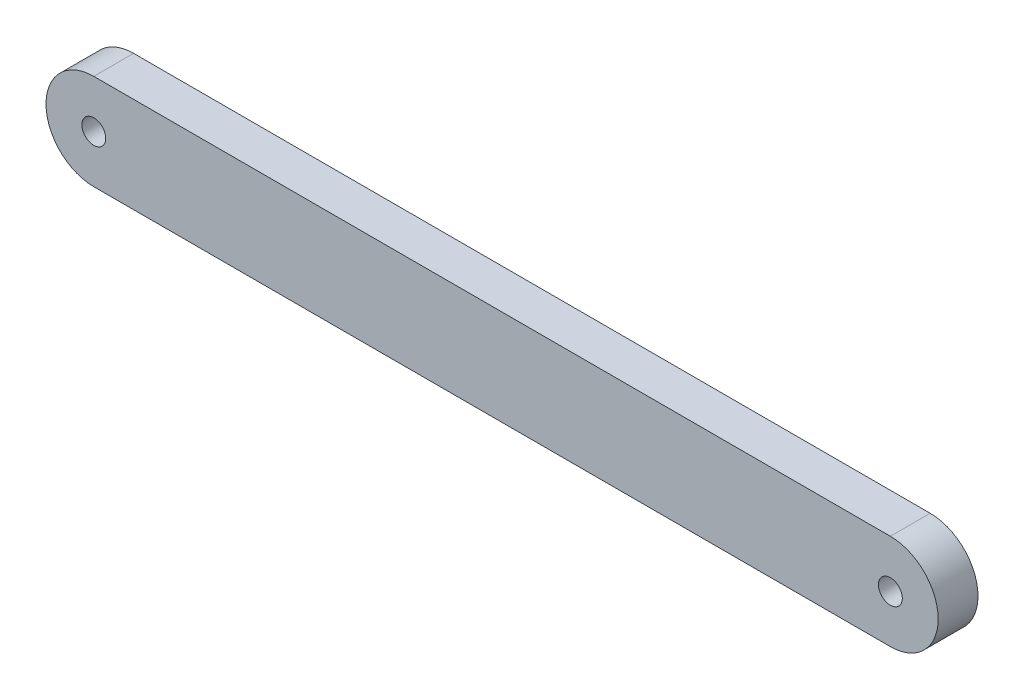
ISO-10303-21;
HEADER;
FILE_DESCRIPTION(('STEP AP214'),'2;1');
FILE_NAME('part.step','',(''),(''),'','','');
FILE_SCHEMA(('AUTOMOTIVE_DESIGN { 1 0 10303 214 1 1 1 1 }'));
ENDSEC;
DATA;
#1=APPLICATION_CONTEXT('core data for automotive mechanical design processes');
#2=APPLICATION_PROTOCOL_DEFINITION('international standard','automotive_design',2000,#1);
#3=PRODUCT_CONTEXT('',#1,'mechanical');
#4=PRODUCT('Part','Part','',(#3));
#5=PRODUCT_RELATED_PRODUCT_CATEGORY('part','',(#4));
#6=PRODUCT_DEFINITION_FORMATION('','',#4);
#7=PRODUCT_DEFINITION_CONTEXT('part definition',#1,'design');
#8=PRODUCT_DEFINITION('design','',#6,#7);
#9=PRODUCT_DEFINITION_SHAPE('','',#8);
#10=(LENGTH_UNIT() NAMED_UNIT(*) SI_UNIT(.MILLI.,.METRE.));
#11=(NAMED_UNIT(*) PLANE_ANGLE_UNIT() SI_UNIT($,.RADIAN.));
#12=(NAMED_UNIT(*) SI_UNIT($,.STERADIAN.) SOLID_ANGLE_UNIT());
#13=UNCERTAINTY_MEASURE_WITH_UNIT(LENGTH_MEASURE(1.E-05),#10,'distance_accuracy_value','');
#14=(GEOMETRIC_REPRESENTATION_CONTEXT(3) GLOBAL_UNCERTAINTY_ASSIGNED_CONTEXT((#13)) GLOBAL_UNIT_ASSIGNED_CONTEXT((#10,
#11,#12)) REPRESENTATION_CONTEXT('',''));
#15=CARTESIAN_POINT('',(0.,0.,0.));
#16=DIRECTION('',(0.,0.,1.));
#17=DIRECTION('',(1.,0.,0.));
#18=AXIS2_PLACEMENT_3D('',#15,#16,#17);
#19=CARTESIAN_POINT('',(-50.,0.,5.));
#20=DIRECTION('',(0.,0.,1.));
#21=DIRECTION('',(1.,0.,0.));
#22=AXIS2_PLACEMENT_3D('',#19,#20,#21);
#23=PLANE('',#22);
#24=CARTESIAN_POINT('',(-50.,0.,5.));
#25=DIRECTION('',(0.,0.,1.));
#26=DIRECTION('',(1.,0.,0.));
#27=AXIS2_PLACEMENT_3D('',#24,#25,#26);
#28=CIRCLE('',#27,1.5);
#29=CARTESIAN_POINT('',(-48.5,0.,5.));
#30=VERTEX_POINT('',#29);
#31=EDGE_CURVE('E102',#30,#30,#28,.T.);
#32=ORIENTED_EDGE('',*,*,#31,.F.);
#33=EDGE_LOOP('',(#32));
#34=FACE_BOUND('',#33,.T.);
#35=CARTESIAN_POINT('',(-50.,0.,5.));
#36=DIRECTION('',(0.,0.,1.));
#37=DIRECTION('',(1.,0.,0.));
#38=AXIS2_PLACEMENT_3D('',#35,#36,#37);
#39=CIRCLE('',#38,6.);
#40=CARTESIAN_POINT('',(-50.,6.,5.));
#41=VERTEX_POINT('',#40);
#42=CARTESIAN_POINT('',(-50.,-6.,5.));
#43=VERTEX_POINT('',#42);
#44=EDGE_CURVE('E87',#41,#43,#39,.T.);
#45=ORIENTED_EDGE('',*,*,#44,.T.);
#46=DIRECTION('',(1.,0.,0.));
#47=VECTOR('',#46,1.);
#48=CARTESIAN_POINT('',(-50.,-6.,5.));
#49=LINE('',#48,#47);
#50=CARTESIAN_POINT('',(50.,-6.,5.));
#51=VERTEX_POINT('',#50);
#52=EDGE_CURVE('E82',#43,#51,#49,.T.);
#53=ORIENTED_EDGE('',*,*,#52,.T.);
#54=CARTESIAN_POINT('',(50.,0.,5.));
#55=DIRECTION('',(0.,0.,1.));
#56=DIRECTION('',(1.,0.,0.));
#57=AXIS2_PLACEMENT_3D('',#54,#55,#56);
#58=CIRCLE('',#57,6.);
#59=CARTESIAN_POINT('',(50.,6.,5.));
#60=VERTEX_POINT('',#59);
#61=EDGE_CURVE('E85',#51,#60,#58,.T.);
#62=ORIENTED_EDGE('',*,*,#61,.T.);
#63=DIRECTION('',(-1.,0.,0.));
#64=VECTOR('',#63,1.);
#65=CARTESIAN_POINT('',(-50.,6.,5.));
#66=LINE('',#65,#64);
#67=EDGE_CURVE('E52',#60,#41,#66,.T.);
#68=ORIENTED_EDGE('',*,*,#67,.T.);
#69=EDGE_LOOP('',(#45,#53,#62,#68));
#70=FACE_BOUND('',#69,.T.);
#71=CARTESIAN_POINT('',(50.,0.,5.));
#72=DIRECTION('',(0.,0.,1.));
#73=DIRECTION('',(1.,0.,0.));
#74=AXIS2_PLACEMENT_3D('',#71,#72,#73);
#75=CIRCLE('',#74,1.5);
#76=CARTESIAN_POINT('',(51.5,0.,5.));
#77=VERTEX_POINT('',#76);
#78=EDGE_CURVE('E117',#77,#77,#75,.T.);
#79=ORIENTED_EDGE('',*,*,#78,.F.);
#80=EDGE_LOOP('',(#79));
#81=FACE_BOUND('',#80,.T.);
#82=ADVANCED_FACE('F35',(#34,#70,#81),#23,.T.);
#83=CARTESIAN_POINT('',(-50.,0.,0.));
#84=DIRECTION('',(0.,0.,1.));
#85=DIRECTION('',(1.,0.,0.));
#86=AXIS2_PLACEMENT_3D('',#83,#84,#85);
#87=PLANE('',#86);
#88=CARTESIAN_POINT('',(-50.,0.,0.));
#89=DIRECTION('',(0.,0.,1.));
#90=DIRECTION('',(1.,0.,0.));
#91=AXIS2_PLACEMENT_3D('',#88,#89,#90);
#92=CIRCLE('',#91,6.);
#93=CARTESIAN_POINT('',(-50.,6.,0.));
#94=VERTEX_POINT('',#93);
#95=CARTESIAN_POINT('',(-50.,-6.,0.));
#96=VERTEX_POINT('',#95);
#97=EDGE_CURVE('E99',#94,#96,#92,.T.);
#98=ORIENTED_EDGE('',*,*,#97,.F.);
#99=DIRECTION('',(-1.,0.,0.));
#100=VECTOR('',#99,1.);
#101=CARTESIAN_POINT('',(-50.,6.,0.));
#102=LINE('',#101,#100);
#103=CARTESIAN_POINT('',(50.,6.,0.));
#104=VERTEX_POINT('',#103);
#105=EDGE_CURVE('E75',#104,#94,#102,.T.);
#106=ORIENTED_EDGE('',*,*,#105,.F.);
#107=CARTESIAN_POINT('',(50.,0.,0.));
#108=DIRECTION('',(0.,0.,1.));
#109=DIRECTION('',(1.,0.,0.));
#110=AXIS2_PLACEMENT_3D('',#107,#108,#109);
#111=CIRCLE('',#110,6.);
#112=CARTESIAN_POINT('',(50.,-6.,0.));
#113=VERTEX_POINT('',#112);
#114=EDGE_CURVE('E69',#113,#104,#111,.T.);
#115=ORIENTED_EDGE('',*,*,#114,.F.);
#116=DIRECTION('',(1.,0.,0.));
#117=VECTOR('',#116,1.);
#118=CARTESIAN_POINT('',(-50.,-6.,0.));
#119=LINE('',#118,#117);
#120=EDGE_CURVE('E91',#96,#113,#119,.T.);
#121=ORIENTED_EDGE('',*,*,#120,.F.);
#122=EDGE_LOOP('',(#98,#106,#115,#121));
#123=FACE_BOUND('',#122,.T.);
#124=CARTESIAN_POINT('',(-50.,0.,0.));
#125=DIRECTION('',(0.,0.,1.));
#126=DIRECTION('',(1.,0.,0.));
#127=AXIS2_PLACEMENT_3D('',#124,#125,#126);
#128=CIRCLE('',#127,1.5);
#129=CARTESIAN_POINT('',(-48.5,0.,0.));
#130=VERTEX_POINT('',#129);
#131=EDGE_CURVE('E114',#130,#130,#128,.T.);
#132=ORIENTED_EDGE('',*,*,#131,.T.);
#133=EDGE_LOOP('',(#132));
#134=FACE_BOUND('',#133,.T.);
#135=CARTESIAN_POINT('',(50.,0.,0.));
#136=DIRECTION('',(0.,0.,1.));
#137=DIRECTION('',(1.,0.,0.));
#138=AXIS2_PLACEMENT_3D('',#135,#136,#137);
#139=CIRCLE('',#138,1.5);
#140=CARTESIAN_POINT('',(51.5,0.,0.));
#141=VERTEX_POINT('',#140);
#142=EDGE_CURVE('E120',#141,#141,#139,.T.);
#143=ORIENTED_EDGE('',*,*,#142,.T.);
#144=EDGE_LOOP('',(#143));
#145=FACE_BOUND('',#144,.T.);
#146=ADVANCED_FACE('F110',(#123,#134,#145),#87,.F.);
#147=CARTESIAN_POINT('',(-50.,0.,5.));
#148=DIRECTION('',(0.,0.,-1.));
#149=DIRECTION('',(-1.,0.,0.));
#150=AXIS2_PLACEMENT_3D('',#147,#148,#149);
#151=CYLINDRICAL_SURFACE('',#150,6.);
#152=ORIENTED_EDGE('',*,*,#97,.T.);
#153=DIRECTION('',(0.,0.,-1.));
#154=VECTOR('',#153,1.);
#155=CARTESIAN_POINT('',(-50.,-6.,5.));
#156=LINE('',#155,#154);
#157=EDGE_CURVE('E11',#43,#96,#156,.T.);
#158=ORIENTED_EDGE('',*,*,#157,.F.);
#159=ORIENTED_EDGE('',*,*,#44,.F.);
#160=DIRECTION('',(0.,0.,-1.));
#161=VECTOR('',#160,1.);
#162=CARTESIAN_POINT('',(-50.,6.,5.));
#163=LINE('',#162,#161);
#164=EDGE_CURVE('E95',#41,#94,#163,.T.);
#165=ORIENTED_EDGE('',*,*,#164,.T.);
#166=EDGE_LOOP('',(#152,#158,#159,#165));
#167=FACE_BOUND('',#166,.T.);
#168=ADVANCED_FACE('F37',(#167),#151,.T.);
#169=CARTESIAN_POINT('',(-50.,-6.,5.));
#170=DIRECTION('',(0.,1.,0.));
#171=DIRECTION('',(0.,0.,1.));
#172=AXIS2_PLACEMENT_3D('',#169,#170,#171);
#173=PLANE('',#172);
#174=ORIENTED_EDGE('',*,*,#120,.T.);
#175=DIRECTION('',(0.,0.,-1.));
#176=VECTOR('',#175,1.);
#177=CARTESIAN_POINT('',(50.,-6.,5.));
#178=LINE('',#177,#176);
#179=EDGE_CURVE('E44',#51,#113,#178,.T.);
#180=ORIENTED_EDGE('',*,*,#179,.F.);
#181=ORIENTED_EDGE('',*,*,#52,.F.);
#182=ORIENTED_EDGE('',*,*,#157,.T.);
#183=EDGE_LOOP('',(#174,#180,#181,#182));
#184=FACE_BOUND('',#183,.T.);
#185=ADVANCED_FACE('F90',(#184),#173,.F.);
#186=CARTESIAN_POINT('',(50.,0.,5.));
#187=DIRECTION('',(0.,0.,-1.));
#188=DIRECTION('',(-1.,0.,0.));
#189=AXIS2_PLACEMENT_3D('',#186,#187,#188);
#190=CYLINDRICAL_SURFACE('',#189,6.);
#191=ORIENTED_EDGE('',*,*,#114,.T.);
#192=DIRECTION('',(0.,0.,-1.));
#193=VECTOR('',#192,1.);
#194=CARTESIAN_POINT('',(50.,6.,5.));
#195=LINE('',#194,#193);
#196=EDGE_CURVE('E92',#60,#104,#195,.T.);
#197=ORIENTED_EDGE('',*,*,#196,.F.);
#198=ORIENTED_EDGE('',*,*,#61,.F.);
#199=ORIENTED_EDGE('',*,*,#179,.T.);
#200=EDGE_LOOP('',(#191,#197,#198,#199));
#201=FACE_BOUND('',#200,.T.);
#202=ADVANCED_FACE('F93',(#201),#190,.T.);
#203=CARTESIAN_POINT('',(-50.,6.,5.));
#204=DIRECTION('',(0.,-1.,0.));
#205=DIRECTION('',(0.,0.,-1.));
#206=AXIS2_PLACEMENT_3D('',#203,#204,#205);
#207=PLANE('',#206);
#208=ORIENTED_EDGE('',*,*,#105,.T.);
#209=ORIENTED_EDGE('',*,*,#164,.F.);
#210=ORIENTED_EDGE('',*,*,#67,.F.);
#211=ORIENTED_EDGE('',*,*,#196,.T.);
#212=EDGE_LOOP('',(#208,#209,#210,#211));
#213=FACE_BOUND('',#212,.T.);
#214=ADVANCED_FACE('F107',(#213),#207,.F.);
#215=CARTESIAN_POINT('',(-50.,0.,5.));
#216=DIRECTION('',(0.,0.,-1.));
#217=DIRECTION('',(-1.,0.,0.));
#218=AXIS2_PLACEMENT_3D('',#215,#216,#217);
#219=CYLINDRICAL_SURFACE('',#218,1.5);
#220=ORIENTED_EDGE('',*,*,#31,.T.);
#221=EDGE_LOOP('',(#220));
#222=FACE_BOUND('',#221,.T.);
#223=ORIENTED_EDGE('',*,*,#131,.F.);
#224=EDGE_LOOP('',(#223));
#225=FACE_BOUND('',#224,.T.);
#226=ADVANCED_FACE('F137',(#222,#225),#219,.F.);
#227=CARTESIAN_POINT('',(50.,0.,5.));
#228=DIRECTION('',(0.,0.,-1.));
#229=DIRECTION('',(-1.,0.,0.));
#230=AXIS2_PLACEMENT_3D('',#227,#228,#229);
#231=CYLINDRICAL_SURFACE('',#230,1.5);
#232=ORIENTED_EDGE('',*,*,#78,.T.);
#233=EDGE_LOOP('',(#232));
#234=FACE_BOUND('',#233,.T.);
#235=ORIENTED_EDGE('',*,*,#142,.F.);
#236=EDGE_LOOP('',(#235));
#237=FACE_BOUND('',#236,.T.);
#238=ADVANCED_FACE('F126',(#234,#237),#231,.F.);
#239=CLOSED_SHELL('',(#82,#146,#168,#185,#202,#214,#226,#238));
#240=MANIFOLD_SOLID_BREP('B2',#239);
#241=ADVANCED_BREP_SHAPE_REPRESENTATION('',(#18,#240),#14);
#242=SHAPE_DEFINITION_REPRESENTATION(#9,#241);
ENDSEC;
END-ISO-10303-21;
